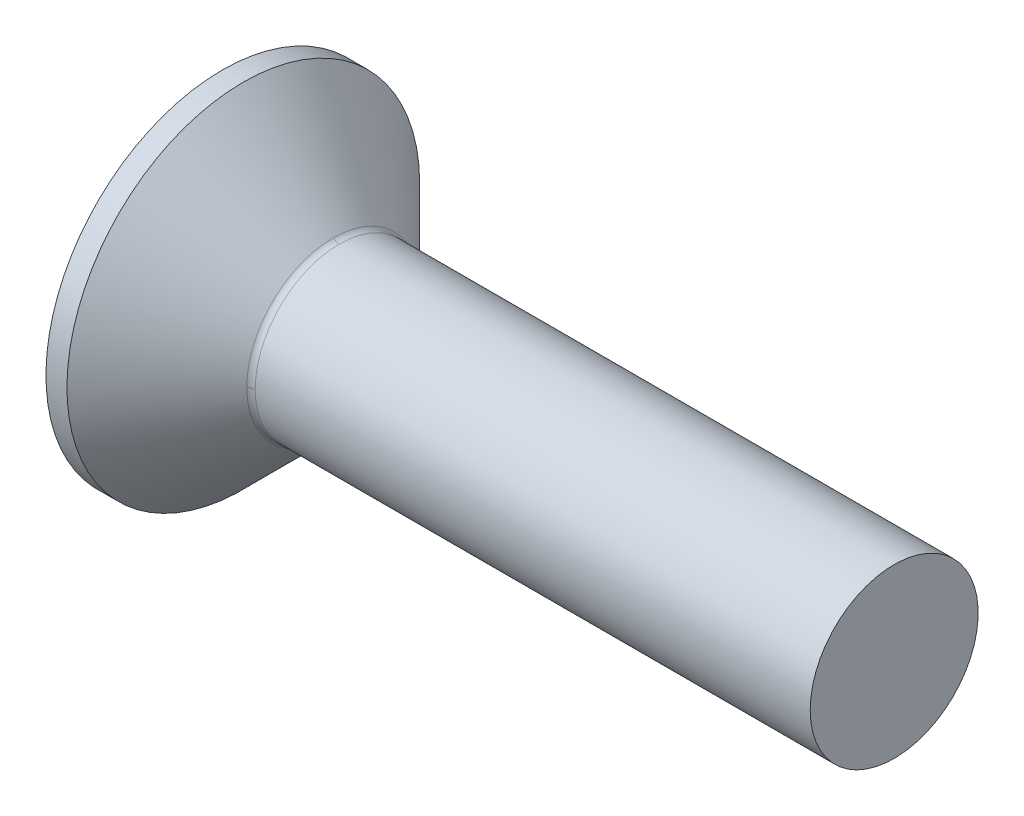
ISO-10303-21;
HEADER;
FILE_DESCRIPTION(('STEP AP214'),'2;1');
FILE_NAME('part.step','',(''),(''),'','','');
FILE_SCHEMA(('AUTOMOTIVE_DESIGN { 1 0 10303 214 1 1 1 1 }'));
ENDSEC;
DATA;
#1=APPLICATION_CONTEXT('core data for automotive mechanical design processes');
#2=APPLICATION_PROTOCOL_DEFINITION('international standard','automotive_design',2000,#1);
#3=PRODUCT_CONTEXT('',#1,'mechanical');
#4=PRODUCT('Part','Part','',(#3));
#5=PRODUCT_RELATED_PRODUCT_CATEGORY('part','',(#4));
#6=PRODUCT_DEFINITION_FORMATION('','',#4);
#7=PRODUCT_DEFINITION_CONTEXT('part definition',#1,'design');
#8=PRODUCT_DEFINITION('design','',#6,#7);
#9=PRODUCT_DEFINITION_SHAPE('','',#8);
#10=(LENGTH_UNIT() NAMED_UNIT(*) SI_UNIT(.MILLI.,.METRE.));
#11=(NAMED_UNIT(*) PLANE_ANGLE_UNIT() SI_UNIT($,.RADIAN.));
#12=(NAMED_UNIT(*) SI_UNIT($,.STERADIAN.) SOLID_ANGLE_UNIT());
#13=UNCERTAINTY_MEASURE_WITH_UNIT(LENGTH_MEASURE(1.E-05),#10,'distance_accuracy_value','');
#14=(GEOMETRIC_REPRESENTATION_CONTEXT(3) GLOBAL_UNCERTAINTY_ASSIGNED_CONTEXT((#13)) GLOBAL_UNIT_ASSIGNED_CONTEXT((#10,
#11,#12)) REPRESENTATION_CONTEXT('',''));
#15=CARTESIAN_POINT('',(0.,0.,0.));
#16=DIRECTION('',(0.,0.,1.));
#17=DIRECTION('',(1.,0.,0.));
#18=AXIS2_PLACEMENT_3D('',#15,#16,#17);
#19=CARTESIAN_POINT('',(16.,0.,0.));
#20=DIRECTION('',(1.,0.,0.));
#21=DIRECTION('',(0.,1.,0.));
#22=AXIS2_PLACEMENT_3D('',#19,#20,#21);
#23=PLANE('',#22);
#24=CARTESIAN_POINT('',(16.,0.,0.));
#25=DIRECTION('',(1.,0.,0.));
#26=DIRECTION('',(0.,0.,1.));
#27=AXIS2_PLACEMENT_3D('',#24,#25,#26);
#28=CIRCLE('',#27,2.);
#29=CARTESIAN_POINT('',(16.,0.,2.));
#30=VERTEX_POINT('',#29);
#31=EDGE_CURVE('E11',#30,#30,#28,.T.);
#32=ORIENTED_EDGE('',*,*,#31,.T.);
#33=EDGE_LOOP('',(#32));
#34=FACE_BOUND('',#33,.T.);
#35=ADVANCED_FACE('F17',(#34),#23,.T.);
#36=CARTESIAN_POINT('',(0.,0.,0.));
#37=DIRECTION('',(1.,0.,0.));
#38=DIRECTION('',(0.,0.,1.));
#39=AXIS2_PLACEMENT_3D('',#36,#37,#38);
#40=CYLINDRICAL_SURFACE('',#39,2.);
#41=CARTESIAN_POINT('',(2.78284271247462,0.,0.));
#42=DIRECTION('',(-1.,0.,0.));
#43=DIRECTION('',(0.,1.,0.));
#44=AXIS2_PLACEMENT_3D('',#41,#42,#43);
#45=CIRCLE('',#44,2.);
#46=CARTESIAN_POINT('',(2.78284271247462,0.,2.));
#47=VERTEX_POINT('',#46);
#48=CARTESIAN_POINT('',(2.78284271247462,2.,0.));
#49=VERTEX_POINT('',#48);
#50=EDGE_CURVE('E28',#47,#49,#45,.T.);
#51=ORIENTED_EDGE('',*,*,#50,.F.);
#52=CARTESIAN_POINT('',(2.78284271247462,0.,0.));
#53=DIRECTION('',(-1.,0.,0.));
#54=DIRECTION('',(0.,0.,1.));
#55=AXIS2_PLACEMENT_3D('',#52,#53,#54);
#56=CIRCLE('',#55,2.);
#57=EDGE_CURVE('E311',#49,#47,#56,.T.);
#58=ORIENTED_EDGE('',*,*,#57,.F.);
#59=EDGE_LOOP('',(#51,#58));
#60=FACE_BOUND('',#59,.T.);
#61=ORIENTED_EDGE('',*,*,#31,.F.);
#62=EDGE_LOOP('',(#61));
#63=FACE_BOUND('',#62,.T.);
#64=ADVANCED_FACE('F599',(#60,#63),#40,.T.);
#65=CARTESIAN_POINT('',(2.78284271247462,0.,0.));
#66=DIRECTION('',(1.,0.,0.));
#67=DIRECTION('',(0.,0.980066577841242,-0.198669330795061));
#68=AXIS2_PLACEMENT_3D('',#65,#66,#67);
#69=TOROIDAL_SURFACE('',#68,2.2,0.2);
#70=ORIENTED_EDGE('',*,*,#50,.T.);
#71=CARTESIAN_POINT('',(2.78284271247462,2.2,0.));
#72=DIRECTION('',(0.,0.,-1.));
#73=DIRECTION('',(0.,-1.,0.));
#74=AXIS2_PLACEMENT_3D('',#71,#72,#73);
#75=CIRCLE('',#74,0.2);
#76=CARTESIAN_POINT('',(2.64142135623731,2.05857864376269,0.));
#77=VERTEX_POINT('',#76);
#78=EDGE_CURVE('E300',#49,#77,#75,.T.);
#79=ORIENTED_EDGE('',*,*,#78,.T.);
#80=CARTESIAN_POINT('',(2.64142135623731,0.,0.));
#81=DIRECTION('',(-1.,0.,0.));
#82=DIRECTION('',(0.,1.,0.));
#83=AXIS2_PLACEMENT_3D('',#80,#81,#82);
#84=CIRCLE('',#83,2.05857864376269);
#85=CARTESIAN_POINT('',(2.64142135623731,0.,2.05857864376269));
#86=VERTEX_POINT('',#85);
#87=EDGE_CURVE('E332',#86,#77,#84,.T.);
#88=ORIENTED_EDGE('',*,*,#87,.F.);
#89=CARTESIAN_POINT('',(2.78284271247462,0.,2.2));
#90=DIRECTION('',(0.,1.,0.));
#91=DIRECTION('',(0.,0.,-1.));
#92=AXIS2_PLACEMENT_3D('',#89,#90,#91);
#93=CIRCLE('',#92,0.2);
#94=EDGE_CURVE('E303',#47,#86,#93,.T.);
#95=ORIENTED_EDGE('',*,*,#94,.F.);
#96=EDGE_LOOP('',(#70,#79,#88,#95));
#97=FACE_BOUND('',#96,.T.);
#98=ADVANCED_FACE('F604',(#97),#69,.F.);
#99=CARTESIAN_POINT('',(2.78284271247462,0.,0.));
#100=DIRECTION('',(1.,0.,0.));
#101=DIRECTION('',(0.,0.198669330795061,0.980066577841242));
#102=AXIS2_PLACEMENT_3D('',#99,#100,#101);
#103=TOROIDAL_SURFACE('',#102,2.2,0.2);
#104=ORIENTED_EDGE('',*,*,#57,.T.);
#105=ORIENTED_EDGE('',*,*,#94,.T.);
#106=CARTESIAN_POINT('',(2.64142135623731,0.,0.));
#107=DIRECTION('',(-1.,0.,0.));
#108=DIRECTION('',(0.,0.,1.));
#109=AXIS2_PLACEMENT_3D('',#106,#107,#108);
#110=CIRCLE('',#109,2.05857864376269);
#111=EDGE_CURVE('E259',#77,#86,#110,.T.);
#112=ORIENTED_EDGE('',*,*,#111,.F.);
#113=ORIENTED_EDGE('',*,*,#78,.F.);
#114=EDGE_LOOP('',(#104,#105,#112,#113));
#115=FACE_BOUND('',#114,.T.);
#116=ADVANCED_FACE('F625',(#115),#103,.F.);
#117=CARTESIAN_POINT('',(1.57071067811866,0.,0.));
#118=DIRECTION('',(-1.,0.,0.));
#119=DIRECTION('',(0.,-1.,0.));
#120=AXIS2_PLACEMENT_3D('',#117,#118,#119);
#121=CONICAL_SURFACE('',#120,3.12928932188134,0.785398163397448);
#122=ORIENTED_EDGE('',*,*,#111,.T.);
#123=ORIENTED_EDGE('',*,*,#87,.T.);
#124=EDGE_LOOP('',(#122,#123));
#125=FACE_BOUND('',#124,.T.);
#126=CARTESIAN_POINT('',(0.5,0.,0.));
#127=DIRECTION('',(1.,0.,0.));
#128=DIRECTION('',(0.,1.,0.));
#129=AXIS2_PLACEMENT_3D('',#126,#127,#128);
#130=CIRCLE('',#129,4.2);
#131=CARTESIAN_POINT('',(0.5,4.2,0.));
#132=VERTEX_POINT('',#131);
#133=EDGE_CURVE('E292',#132,#132,#130,.T.);
#134=ORIENTED_EDGE('',*,*,#133,.T.);
#135=EDGE_LOOP('',(#134));
#136=FACE_BOUND('',#135,.T.);
#137=ADVANCED_FACE('F630',(#125,#136),#121,.T.);
#138=CARTESIAN_POINT('',(2.6,0.,0.));
#139=DIRECTION('',(1.,0.,0.));
#140=DIRECTION('',(0.,1.,0.));
#141=AXIS2_PLACEMENT_3D('',#138,#139,#140);
#142=PLANE('',#141);
#143=DIRECTION('',(0.,0.,1.));
#144=VECTOR('',#143,1.);
#145=CARTESIAN_POINT('',(2.6,0.172517251725172,0.443540079669605));
#146=LINE('',#145,#144);
#147=CARTESIAN_POINT('',(2.6,0.172517251725172,0.443540079669605));
#148=VERTEX_POINT('',#147);
#149=CARTESIAN_POINT('',(2.6,0.172517251725172,0.668156442865066));
#150=VERTEX_POINT('',#149);
#151=EDGE_CURVE('E366',#148,#150,#146,.T.);
#152=ORIENTED_EDGE('',*,*,#151,.F.);
#153=DIRECTION('',(0.,-0.272628878987048,0.962119272409749));
#154=VECTOR('',#153,1.);
#155=CARTESIAN_POINT('',(2.6,0.232358321079116,0.232358321079116));
#156=LINE('',#155,#154);
#157=CARTESIAN_POINT('',(2.6,0.232358321079116,0.232358321079116));
#158=VERTEX_POINT('',#157);
#159=EDGE_CURVE('E317',#158,#148,#156,.T.);
#160=ORIENTED_EDGE('',*,*,#159,.F.);
#161=DIRECTION('',(0.,-0.96211927240975,0.272628878987045));
#162=VECTOR('',#161,1.);
#163=CARTESIAN_POINT('',(2.6,0.443540079669605,0.172517251725173));
#164=LINE('',#163,#162);
#165=CARTESIAN_POINT('',(2.6,0.443540079669605,0.172517251725173));
#166=VERTEX_POINT('',#165);
#167=EDGE_CURVE('E316',#166,#158,#164,.T.);
#168=ORIENTED_EDGE('',*,*,#167,.F.);
#169=DIRECTION('',(0.,-1.,0.));
#170=VECTOR('',#169,1.);
#171=CARTESIAN_POINT('',(2.6,0.668156442865066,0.172517251725173));
#172=LINE('',#171,#170);
#173=CARTESIAN_POINT('',(2.6,0.668156442865066,0.172517251725173));
#174=VERTEX_POINT('',#173);
#175=EDGE_CURVE('E273',#174,#166,#172,.T.);
#176=ORIENTED_EDGE('',*,*,#175,.F.);
#177=DIRECTION('',(0.,0.,1.));
#178=VECTOR('',#177,1.);
#179=CARTESIAN_POINT('',(2.6,0.668156442865066,-0.172517251725172));
#180=LINE('',#179,#178);
#181=CARTESIAN_POINT('',(2.6,0.668156442865066,-0.172517251725172));
#182=VERTEX_POINT('',#181);
#183=EDGE_CURVE('E338',#182,#174,#180,.T.);
#184=ORIENTED_EDGE('',*,*,#183,.F.);
#185=DIRECTION('',(0.,1.,0.));
#186=VECTOR('',#185,1.);
#187=CARTESIAN_POINT('',(2.6,0.443540079669605,-0.172517251725172));
#188=LINE('',#187,#186);
#189=CARTESIAN_POINT('',(2.6,0.443540079669605,-0.172517251725172));
#190=VERTEX_POINT('',#189);
#191=EDGE_CURVE('E337',#190,#182,#188,.T.);
#192=ORIENTED_EDGE('',*,*,#191,.F.);
#193=DIRECTION('',(0.,0.96211927240975,0.272628878987047));
#194=VECTOR('',#193,1.);
#195=CARTESIAN_POINT('',(2.6,0.232358321079116,-0.232358321079116));
#196=LINE('',#195,#194);
#197=CARTESIAN_POINT('',(2.6,0.232358321079116,-0.232358321079116));
#198=VERTEX_POINT('',#197);
#199=EDGE_CURVE('E304',#198,#190,#196,.T.);
#200=ORIENTED_EDGE('',*,*,#199,.F.);
#201=DIRECTION('',(0.,0.272628878987045,0.96211927240975));
#202=VECTOR('',#201,1.);
#203=CARTESIAN_POINT('',(2.6,0.172517251725173,-0.443540079669605));
#204=LINE('',#203,#202);
#205=CARTESIAN_POINT('',(2.6,0.172517251725173,-0.443540079669605));
#206=VERTEX_POINT('',#205);
#207=EDGE_CURVE('E339',#206,#198,#204,.T.);
#208=ORIENTED_EDGE('',*,*,#207,.F.);
#209=DIRECTION('',(0.,0.,1.));
#210=VECTOR('',#209,1.);
#211=CARTESIAN_POINT('',(2.6,0.172517251725173,-0.668156442865066));
#212=LINE('',#211,#210);
#213=CARTESIAN_POINT('',(2.6,0.172517251725173,-0.668156442865066));
#214=VERTEX_POINT('',#213);
#215=EDGE_CURVE('E299',#214,#206,#212,.T.);
#216=ORIENTED_EDGE('',*,*,#215,.F.);
#217=DIRECTION('',(0.,1.,0.));
#218=VECTOR('',#217,1.);
#219=CARTESIAN_POINT('',(2.6,-0.172517251725172,-0.668156442865066));
#220=LINE('',#219,#218);
#221=CARTESIAN_POINT('',(2.6,-0.172517251725172,-0.668156442865066));
#222=VERTEX_POINT('',#221);
#223=EDGE_CURVE('E298',#222,#214,#220,.T.);
#224=ORIENTED_EDGE('',*,*,#223,.F.);
#225=DIRECTION('',(0.,0.,-1.));
#226=VECTOR('',#225,1.);
#227=CARTESIAN_POINT('',(2.6,-0.172517251725172,-0.443540079669605));
#228=LINE('',#227,#226);
#229=CARTESIAN_POINT('',(2.6,-0.172517251725172,-0.443540079669605));
#230=VERTEX_POINT('',#229);
#231=EDGE_CURVE('E261',#230,#222,#228,.T.);
#232=ORIENTED_EDGE('',*,*,#231,.F.);
#233=DIRECTION('',(0.,0.272628878987046,-0.96211927240975));
#234=VECTOR('',#233,1.);
#235=CARTESIAN_POINT('',(2.6,-0.232358321079116,-0.232358321079116));
#236=LINE('',#235,#234);
#237=CARTESIAN_POINT('',(2.6,-0.232358321079116,-0.232358321079116));
#238=VERTEX_POINT('',#237);
#239=EDGE_CURVE('E378',#238,#230,#236,.T.);
#240=ORIENTED_EDGE('',*,*,#239,.F.);
#241=DIRECTION('',(0.,0.96211927240975,-0.272628878987046));
#242=VECTOR('',#241,1.);
#243=CARTESIAN_POINT('',(2.6,-0.443540079669605,-0.172517251725172));
#244=LINE('',#243,#242);
#245=CARTESIAN_POINT('',(2.6,-0.443540079669605,-0.172517251725172));
#246=VERTEX_POINT('',#245);
#247=EDGE_CURVE('E284',#246,#238,#244,.T.);
#248=ORIENTED_EDGE('',*,*,#247,.F.);
#249=DIRECTION('',(0.,1.,0.));
#250=VECTOR('',#249,1.);
#251=CARTESIAN_POINT('',(2.6,-0.668156442865066,-0.172517251725172));
#252=LINE('',#251,#250);
#253=CARTESIAN_POINT('',(2.6,-0.668156442865066,-0.172517251725172));
#254=VERTEX_POINT('',#253);
#255=EDGE_CURVE('E230',#254,#246,#252,.T.);
#256=ORIENTED_EDGE('',*,*,#255,.F.);
#257=DIRECTION('',(0.,0.,-1.));
#258=VECTOR('',#257,1.);
#259=CARTESIAN_POINT('',(2.6,-0.668156442865066,0.172517251725173));
#260=LINE('',#259,#258);
#261=CARTESIAN_POINT('',(2.6,-0.668156442865066,0.172517251725173));
#262=VERTEX_POINT('',#261);
#263=EDGE_CURVE('E229',#262,#254,#260,.T.);
#264=ORIENTED_EDGE('',*,*,#263,.F.);
#265=DIRECTION('',(0.,-1.,0.));
#266=VECTOR('',#265,1.);
#267=CARTESIAN_POINT('',(2.6,-0.443540079669605,0.172517251725173));
#268=LINE('',#267,#266);
#269=CARTESIAN_POINT('',(2.6,-0.443540079669605,0.172517251725173));
#270=VERTEX_POINT('',#269);
#271=EDGE_CURVE('E225',#270,#262,#268,.T.);
#272=ORIENTED_EDGE('',*,*,#271,.F.);
#273=DIRECTION('',(0.,-0.96211927240975,-0.272628878987045));
#274=VECTOR('',#273,1.);
#275=CARTESIAN_POINT('',(2.6,-0.232358321079116,0.232358321079116));
#276=LINE('',#275,#274);
#277=CARTESIAN_POINT('',(2.6,-0.232358321079116,0.232358321079116));
#278=VERTEX_POINT('',#277);
#279=EDGE_CURVE('E21',#278,#270,#276,.T.);
#280=ORIENTED_EDGE('',*,*,#279,.F.);
#281=DIRECTION('',(0.,-0.272628878987044,-0.962119272409751));
#282=VECTOR('',#281,1.);
#283=CARTESIAN_POINT('',(2.6,-0.172517251725173,0.443540079669605));
#284=LINE('',#283,#282);
#285=CARTESIAN_POINT('',(2.6,-0.172517251725173,0.443540079669605));
#286=VERTEX_POINT('',#285);
#287=EDGE_CURVE('E410',#286,#278,#284,.T.);
#288=ORIENTED_EDGE('',*,*,#287,.F.);
#289=DIRECTION('',(0.,0.,-1.));
#290=VECTOR('',#289,1.);
#291=CARTESIAN_POINT('',(2.6,-0.172517251725172,0.668156442865066));
#292=LINE('',#291,#290);
#293=CARTESIAN_POINT('',(2.6,-0.172517251725172,0.668156442865066));
#294=VERTEX_POINT('',#293);
#295=EDGE_CURVE('E293',#294,#286,#292,.T.);
#296=ORIENTED_EDGE('',*,*,#295,.F.);
#297=DIRECTION('',(0.,-1.,0.));
#298=VECTOR('',#297,1.);
#299=CARTESIAN_POINT('',(2.6,0.172517251725172,0.668156442865066));
#300=LINE('',#299,#298);
#301=EDGE_CURVE('E288',#150,#294,#300,.T.);
#302=ORIENTED_EDGE('',*,*,#301,.F.);
#303=EDGE_LOOP('',(#152,#160,#168,#176,#184,#192,#200,#208,#216,#224,#232,#240,#248,#256,#264,
#272,#280,#288,#296,#302));
#304=FACE_BOUND('',#303,.T.);
#305=ADVANCED_FACE('F503',(#304),#142,.F.);
#306=CARTESIAN_POINT('',(0.,0.,0.));
#307=DIRECTION('',(1.,0.,0.));
#308=DIRECTION('',(0.,1.,0.));
#309=AXIS2_PLACEMENT_3D('',#306,#307,#308);
#310=CYLINDRICAL_SURFACE('',#309,4.2);
#311=ORIENTED_EDGE('',*,*,#133,.F.);
#312=EDGE_LOOP('',(#311));
#313=FACE_BOUND('',#312,.T.);
#314=CARTESIAN_POINT('',(0.,0.,0.));
#315=DIRECTION('',(1.,0.,0.));
#316=DIRECTION('',(0.,1.,0.));
#317=AXIS2_PLACEMENT_3D('',#314,#315,#316);
#318=CIRCLE('',#317,4.2);
#319=CARTESIAN_POINT('',(0.,4.2,0.));
#320=VERTEX_POINT('',#319);
#321=EDGE_CURVE('E357',#320,#320,#318,.T.);
#322=ORIENTED_EDGE('',*,*,#321,.T.);
#323=EDGE_LOOP('',(#322));
#324=FACE_BOUND('',#323,.T.);
#325=ADVANCED_FACE('F647',(#313,#324),#310,.T.);
#326=CARTESIAN_POINT('',(0.,0.575,2.22696542406926));
#327=DIRECTION('',(0.514206841452647,0.,0.85766620791733));
#328=DIRECTION('',(0.,-1.,0.));
#329=AXIS2_PLACEMENT_3D('',#326,#327,#328);
#330=PLANE('',#329);
#331=DIRECTION('',(0.,-1.,0.));
#332=VECTOR('',#331,1.);
#333=CARTESIAN_POINT('',(0.,0.575,2.22696542406926));
#334=LINE('',#333,#332);
#335=CARTESIAN_POINT('',(0.,0.575,2.22696542406926));
#336=VERTEX_POINT('',#335);
#337=CARTESIAN_POINT('',(0.,-0.575,2.22696542406926));
#338=VERTEX_POINT('',#337);
#339=EDGE_CURVE('E321',#336,#338,#334,.T.);
#340=ORIENTED_EDGE('',*,*,#339,.F.);
#341=DIRECTION('',(0.850205551202319,-0.131612718017855,-0.509733865032247));
#342=VECTOR('',#341,1.);
#343=CARTESIAN_POINT('',(0.,0.575,2.22696542406926));
#344=LINE('',#343,#342);
#345=EDGE_CURVE('E362',#336,#150,#344,.T.);
#346=ORIENTED_EDGE('',*,*,#345,.T.);
#347=ORIENTED_EDGE('',*,*,#301,.T.);
#348=DIRECTION('',(0.850205551202319,0.131612718017856,-0.509733865032246));
#349=VECTOR('',#348,1.);
#350=CARTESIAN_POINT('',(0.,-0.575,2.22696542406926));
#351=LINE('',#350,#349);
#352=EDGE_CURVE('E325',#338,#294,#351,.T.);
#353=ORIENTED_EDGE('',*,*,#352,.F.);
#354=EDGE_LOOP('',(#340,#346,#347,#353));
#355=FACE_BOUND('',#354,.T.);
#356=ADVANCED_FACE('F520',(#355),#330,.F.);
#357=CARTESIAN_POINT('',(0.,-0.575,2.22696542406926));
#358=DIRECTION('',(0.152978962750563,-0.988229445501277,0.));
#359=DIRECTION('',(0.,0.,-1.));
#360=AXIS2_PLACEMENT_3D('',#357,#358,#359);
#361=PLANE('',#360);
#362=DIRECTION('',(0.,0.,-1.));
#363=VECTOR('',#362,1.);
#364=CARTESIAN_POINT('',(0.,-0.575,2.22696542406926));
#365=LINE('',#364,#363);
#366=CARTESIAN_POINT('',(0.,-0.575,1.47831908553879));
#367=VERTEX_POINT('',#366);
#368=EDGE_CURVE('E318',#338,#367,#365,.T.);
#369=ORIENTED_EDGE('',*,*,#368,.F.);
#370=ORIENTED_EDGE('',*,*,#352,.T.);
#371=ORIENTED_EDGE('',*,*,#295,.T.);
#372=DIRECTION('',(0.919655056316218,0.142363574819613,-0.366015286506718));
#373=VECTOR('',#372,1.);
#374=CARTESIAN_POINT('',(0.,-0.575,1.47831908553879));
#375=LINE('',#374,#373);
#376=EDGE_CURVE('E406',#367,#286,#375,.T.);
#377=ORIENTED_EDGE('',*,*,#376,.F.);
#378=EDGE_LOOP('',(#369,#370,#371,#377));
#379=FACE_BOUND('',#378,.T.);
#380=ADVANCED_FACE('F524',(#379),#361,.F.);
#381=CARTESIAN_POINT('',(0.,-0.575,1.47831908553879));
#382=DIRECTION('',(0.249312008142373,-0.931738638625509,0.264020135384217));
#383=DIRECTION('',(-0.966015607772417,-0.258483743280089,0.));
#384=AXIS2_PLACEMENT_3D('',#381,#382,#383);
#385=PLANE('',#384);
#386=DIRECTION('',(0.,-0.272628878987044,-0.962119272409751));
#387=VECTOR('',#386,1.);
#388=CARTESIAN_POINT('',(0.,-0.575,1.47831908553879));
#389=LINE('',#388,#387);
#390=CARTESIAN_POINT('',(0.,-0.774450284156694,0.774450284156694));
#391=VERTEX_POINT('',#390);
#392=EDGE_CURVE('E255',#367,#391,#389,.T.);
#393=ORIENTED_EDGE('',*,*,#392,.F.);
#394=ORIENTED_EDGE('',*,*,#376,.T.);
#395=ORIENTED_EDGE('',*,*,#287,.T.);
#396=DIRECTION('',(0.95917274636367,0.199984552694921,-0.199984552694921));
#397=VECTOR('',#396,1.);
#398=CARTESIAN_POINT('',(0.,-0.774450284156694,0.774450284156694));
#399=LINE('',#398,#397);
#400=EDGE_CURVE('E434',#391,#278,#399,.T.);
#401=ORIENTED_EDGE('',*,*,#400,.F.);
#402=EDGE_LOOP('',(#393,#394,#395,#401));
#403=FACE_BOUND('',#402,.T.);
#404=ADVANCED_FACE('F19',(#403),#385,.F.);
#405=CARTESIAN_POINT('',(0.,-0.774450284156694,0.774450284156694));
#406=DIRECTION('',(0.249312008142374,-0.264020135384219,0.931738638625508));
#407=DIRECTION('',(-0.7270686071443,-0.686564811583908,0.));
#408=AXIS2_PLACEMENT_3D('',#405,#406,#407);
#409=PLANE('',#408);
#410=DIRECTION('',(0.,-0.96211927240975,-0.272628878987046));
#411=VECTOR('',#410,1.);
#412=CARTESIAN_POINT('',(0.,-0.774450284156694,0.774450284156694));
#413=LINE('',#412,#411);
#414=CARTESIAN_POINT('',(0.,-1.47831908553879,0.575));
#415=VERTEX_POINT('',#414);
#416=EDGE_CURVE('E248',#391,#415,#413,.T.);
#417=ORIENTED_EDGE('',*,*,#416,.F.);
#418=ORIENTED_EDGE('',*,*,#400,.T.);
#419=ORIENTED_EDGE('',*,*,#279,.T.);
#420=DIRECTION('',(0.919655056316218,0.366015286506719,-0.142363574819612));
#421=VECTOR('',#420,1.);
#422=CARTESIAN_POINT('',(0.,-1.47831908553879,0.575));
#423=LINE('',#422,#421);
#424=EDGE_CURVE('E328',#415,#270,#423,.T.);
#425=ORIENTED_EDGE('',*,*,#424,.F.);
#426=EDGE_LOOP('',(#417,#418,#419,#425));
#427=FACE_BOUND('',#426,.T.);
#428=ADVANCED_FACE('F530',(#427),#409,.F.);
#429=CARTESIAN_POINT('',(0.,-1.47831908553879,0.575));
#430=DIRECTION('',(0.152978962750562,0.,0.988229445501277));
#431=DIRECTION('',(0.,-1.,0.));
#432=AXIS2_PLACEMENT_3D('',#429,#430,#431);
#433=PLANE('',#432);
#434=DIRECTION('',(0.,-1.,0.));
#435=VECTOR('',#434,1.);
#436=CARTESIAN_POINT('',(0.,-1.47831908553879,0.575));
#437=LINE('',#436,#435);
#438=CARTESIAN_POINT('',(0.,-2.22696542406926,0.575));
#439=VERTEX_POINT('',#438);
#440=EDGE_CURVE('E222',#415,#439,#437,.T.);
#441=ORIENTED_EDGE('',*,*,#440,.F.);
#442=ORIENTED_EDGE('',*,*,#424,.T.);
#443=ORIENTED_EDGE('',*,*,#271,.T.);
#444=DIRECTION('',(0.85020555120232,0.509733865032246,-0.131612718017855));
#445=VECTOR('',#444,1.);
#446=CARTESIAN_POINT('',(0.,-2.22696542406926,0.575));
#447=LINE('',#446,#445);
#448=EDGE_CURVE('E217',#439,#262,#447,.T.);
#449=ORIENTED_EDGE('',*,*,#448,.F.);
#450=EDGE_LOOP('',(#441,#442,#443,#449));
#451=FACE_BOUND('',#450,.T.);
#452=ADVANCED_FACE('F219',(#451),#433,.F.);
#453=CARTESIAN_POINT('',(0.,-2.22696542406926,0.575));
#454=DIRECTION('',(0.514206841452646,-0.85766620791733,0.));
#455=DIRECTION('',(0.,0.,-1.));
#456=AXIS2_PLACEMENT_3D('',#453,#454,#455);
#457=PLANE('',#456);
#458=DIRECTION('',(0.,0.,-1.));
#459=VECTOR('',#458,1.);
#460=CARTESIAN_POINT('',(0.,-2.22696542406926,0.575));
#461=LINE('',#460,#459);
#462=CARTESIAN_POINT('',(0.,-2.22696542406926,-0.575));
#463=VERTEX_POINT('',#462);
#464=EDGE_CURVE('E233',#439,#463,#461,.T.);
#465=ORIENTED_EDGE('',*,*,#464,.F.);
#466=ORIENTED_EDGE('',*,*,#448,.T.);
#467=ORIENTED_EDGE('',*,*,#263,.T.);
#468=DIRECTION('',(0.85020555120232,0.509733865032246,0.131612718017856));
#469=VECTOR('',#468,1.);
#470=CARTESIAN_POINT('',(0.,-2.22696542406926,-0.575));
#471=LINE('',#470,#469);
#472=EDGE_CURVE('E236',#463,#254,#471,.T.);
#473=ORIENTED_EDGE('',*,*,#472,.F.);
#474=EDGE_LOOP('',(#465,#466,#467,#473));
#475=FACE_BOUND('',#474,.T.);
#476=ADVANCED_FACE('F234',(#475),#457,.F.);
#477=CARTESIAN_POINT('',(0.,-2.22696542406926,-0.575));
#478=DIRECTION('',(0.152978962750563,0.,-0.988229445501277));
#479=DIRECTION('',(0.,-1.,0.));
#480=AXIS2_PLACEMENT_3D('',#477,#478,#479);
#481=PLANE('',#480);
#482=DIRECTION('',(0.,1.,0.));
#483=VECTOR('',#482,1.);
#484=CARTESIAN_POINT('',(0.,-2.22696542406926,-0.575));
#485=LINE('',#484,#483);
#486=CARTESIAN_POINT('',(0.,-1.47831908553879,-0.575));
#487=VERTEX_POINT('',#486);
#488=EDGE_CURVE('E241',#463,#487,#485,.T.);
#489=ORIENTED_EDGE('',*,*,#488,.F.);
#490=ORIENTED_EDGE('',*,*,#472,.T.);
#491=ORIENTED_EDGE('',*,*,#255,.T.);
#492=DIRECTION('',(0.919655056316218,0.366015286506718,0.142363574819613));
#493=VECTOR('',#492,1.);
#494=CARTESIAN_POINT('',(0.,-1.47831908553879,-0.575));
#495=LINE('',#494,#493);
#496=EDGE_CURVE('E286',#487,#246,#495,.T.);
#497=ORIENTED_EDGE('',*,*,#496,.F.);
#498=EDGE_LOOP('',(#489,#490,#491,#497));
#499=FACE_BOUND('',#498,.T.);
#500=ADVANCED_FACE('F535',(#499),#481,.F.);
#501=CARTESIAN_POINT('',(0.,-1.47831908553879,-0.575));
#502=DIRECTION('',(0.249312008142374,-0.264020135384218,-0.931738638625509));
#503=DIRECTION('',(0.,-0.96211927240975,0.272628878987045));
#504=AXIS2_PLACEMENT_3D('',#501,#502,#503);
#505=PLANE('',#504);
#506=DIRECTION('',(0.,0.96211927240975,-0.272628878987045));
#507=VECTOR('',#506,1.);
#508=CARTESIAN_POINT('',(0.,-1.47831908553879,-0.575));
#509=LINE('',#508,#507);
#510=CARTESIAN_POINT('',(0.,-0.774450284156695,-0.774450284156695));
#511=VERTEX_POINT('',#510);
#512=EDGE_CURVE('E267',#487,#511,#509,.T.);
#513=ORIENTED_EDGE('',*,*,#512,.F.);
#514=ORIENTED_EDGE('',*,*,#496,.T.);
#515=ORIENTED_EDGE('',*,*,#247,.T.);
#516=DIRECTION('',(0.95917274636367,0.199984552694921,0.199984552694921));
#517=VECTOR('',#516,1.);
#518=CARTESIAN_POINT('',(0.,-0.774450284156695,-0.774450284156695));
#519=LINE('',#518,#517);
#520=EDGE_CURVE('E263',#511,#238,#519,.T.);
#521=ORIENTED_EDGE('',*,*,#520,.F.);
#522=EDGE_LOOP('',(#513,#514,#515,#521));
#523=FACE_BOUND('',#522,.T.);
#524=ADVANCED_FACE('F540',(#523),#505,.F.);
#525=CARTESIAN_POINT('',(0.,-0.774450284156695,-0.774450284156695));
#526=DIRECTION('',(0.249312008142374,-0.931738638625509,-0.264020135384218));
#527=DIRECTION('',(0.,0.272628878987045,-0.96211927240975));
#528=AXIS2_PLACEMENT_3D('',#525,#526,#527);
#529=PLANE('',#528);
#530=DIRECTION('',(0.,0.272628878987045,-0.96211927240975));
#531=VECTOR('',#530,1.);
#532=CARTESIAN_POINT('',(0.,-0.774450284156695,-0.774450284156695));
#533=LINE('',#532,#531);
#534=CARTESIAN_POINT('',(0.,-0.575,-1.47831908553879));
#535=VERTEX_POINT('',#534);
#536=EDGE_CURVE('E268',#511,#535,#533,.T.);
#537=ORIENTED_EDGE('',*,*,#536,.F.);
#538=ORIENTED_EDGE('',*,*,#520,.T.);
#539=ORIENTED_EDGE('',*,*,#239,.T.);
#540=DIRECTION('',(0.919655056316218,0.142363574819613,0.366015286506718));
#541=VECTOR('',#540,1.);
#542=CARTESIAN_POINT('',(0.,-0.575,-1.47831908553879));
#543=LINE('',#542,#541);
#544=EDGE_CURVE('E264',#535,#230,#543,.T.);
#545=ORIENTED_EDGE('',*,*,#544,.F.);
#546=EDGE_LOOP('',(#537,#538,#539,#545));
#547=FACE_BOUND('',#546,.T.);
#548=ADVANCED_FACE('F542',(#547),#529,.F.);
#549=CARTESIAN_POINT('',(0.,-0.575,-1.47831908553879));
#550=DIRECTION('',(0.152978962750563,-0.988229445501277,0.));
#551=DIRECTION('',(0.,0.,-1.));
#552=AXIS2_PLACEMENT_3D('',#549,#550,#551);
#553=PLANE('',#552);
#554=DIRECTION('',(0.,0.,-1.));
#555=VECTOR('',#554,1.);
#556=CARTESIAN_POINT('',(0.,-0.575,-1.47831908553879));
#557=LINE('',#556,#555);
#558=CARTESIAN_POINT('',(0.,-0.575,-2.22696542406926));
#559=VERTEX_POINT('',#558);
#560=EDGE_CURVE('E272',#535,#559,#557,.T.);
#561=ORIENTED_EDGE('',*,*,#560,.F.);
#562=ORIENTED_EDGE('',*,*,#544,.T.);
#563=ORIENTED_EDGE('',*,*,#231,.T.);
#564=DIRECTION('',(0.850205551202319,0.131612718017856,0.509733865032247));
#565=VECTOR('',#564,1.);
#566=CARTESIAN_POINT('',(0.,-0.575,-2.22696542406926));
#567=LINE('',#566,#565);
#568=EDGE_CURVE('E294',#559,#222,#567,.T.);
#569=ORIENTED_EDGE('',*,*,#568,.F.);
#570=EDGE_LOOP('',(#561,#562,#563,#569));
#571=FACE_BOUND('',#570,.T.);
#572=ADVANCED_FACE('F545',(#571),#553,.F.);
#573=CARTESIAN_POINT('',(0.,-0.575,-2.22696542406926));
#574=DIRECTION('',(0.514206841452647,0.,-0.85766620791733));
#575=DIRECTION('',(0.,-1.,0.));
#576=AXIS2_PLACEMENT_3D('',#573,#574,#575);
#577=PLANE('',#576);
#578=DIRECTION('',(0.,1.,0.));
#579=VECTOR('',#578,1.);
#580=CARTESIAN_POINT('',(0.,-0.575,-2.22696542406926));
#581=LINE('',#580,#579);
#582=CARTESIAN_POINT('',(0.,0.575,-2.22696542406926));
#583=VERTEX_POINT('',#582);
#584=EDGE_CURVE('E384',#559,#583,#581,.T.);
#585=ORIENTED_EDGE('',*,*,#584,.F.);
#586=ORIENTED_EDGE('',*,*,#568,.T.);
#587=ORIENTED_EDGE('',*,*,#223,.T.);
#588=DIRECTION('',(0.850205551202319,-0.131612718017855,0.509733865032247));
#589=VECTOR('',#588,1.);
#590=CARTESIAN_POINT('',(0.,0.575,-2.22696542406926));
#591=LINE('',#590,#589);
#592=EDGE_CURVE('E342',#583,#214,#591,.T.);
#593=ORIENTED_EDGE('',*,*,#592,.F.);
#594=EDGE_LOOP('',(#585,#586,#587,#593));
#595=FACE_BOUND('',#594,.T.);
#596=ADVANCED_FACE('F462',(#595),#577,.F.);
#597=CARTESIAN_POINT('',(0.,0.575,-2.22696542406926));
#598=DIRECTION('',(0.152978962750562,0.988229445501277,0.));
#599=DIRECTION('',(0.,0.,-1.));
#600=AXIS2_PLACEMENT_3D('',#597,#598,#599);
#601=PLANE('',#600);
#602=DIRECTION('',(0.,0.,1.));
#603=VECTOR('',#602,1.);
#604=CARTESIAN_POINT('',(0.,0.575,-2.22696542406926));
#605=LINE('',#604,#603);
#606=CARTESIAN_POINT('',(0.,0.575,-1.47831908553879));
#607=VERTEX_POINT('',#606);
#608=EDGE_CURVE('E375',#583,#607,#605,.T.);
#609=ORIENTED_EDGE('',*,*,#608,.F.);
#610=ORIENTED_EDGE('',*,*,#592,.T.);
#611=ORIENTED_EDGE('',*,*,#215,.T.);
#612=DIRECTION('',(0.919655056316218,-0.142363574819612,0.366015286506718));
#613=VECTOR('',#612,1.);
#614=CARTESIAN_POINT('',(0.,0.575,-1.47831908553879));
#615=LINE('',#614,#613);
#616=EDGE_CURVE('E307',#607,#206,#615,.T.);
#617=ORIENTED_EDGE('',*,*,#616,.F.);
#618=EDGE_LOOP('',(#609,#610,#611,#617));
#619=FACE_BOUND('',#618,.T.);
#620=ADVANCED_FACE('F469',(#619),#601,.F.);
#621=CARTESIAN_POINT('',(0.,0.575,-1.47831908553879));
#622=DIRECTION('',(0.249312008142374,0.931738638625508,-0.264020135384221));
#623=DIRECTION('',(-0.727068607144303,0.,-0.686564811583906));
#624=AXIS2_PLACEMENT_3D('',#621,#622,#623);
#625=PLANE('',#624);
#626=DIRECTION('',(0.,0.272628878987048,0.962119272409749));
#627=VECTOR('',#626,1.);
#628=CARTESIAN_POINT('',(0.,0.575,-1.47831908553879));
#629=LINE('',#628,#627);
#630=CARTESIAN_POINT('',(0.,0.774450284156695,-0.774450284156695));
#631=VERTEX_POINT('',#630);
#632=EDGE_CURVE('E370',#607,#631,#629,.T.);
#633=ORIENTED_EDGE('',*,*,#632,.F.);
#634=ORIENTED_EDGE('',*,*,#616,.T.);
#635=ORIENTED_EDGE('',*,*,#207,.T.);
#636=DIRECTION('',(0.95917274636367,-0.199984552694921,0.199984552694921));
#637=VECTOR('',#636,1.);
#638=CARTESIAN_POINT('',(0.,0.774450284156695,-0.774450284156695));
#639=LINE('',#638,#637);
#640=EDGE_CURVE('E308',#631,#198,#639,.T.);
#641=ORIENTED_EDGE('',*,*,#640,.F.);
#642=EDGE_LOOP('',(#633,#634,#635,#641));
#643=FACE_BOUND('',#642,.T.);
#644=ADVANCED_FACE('F473',(#643),#625,.F.);
#645=CARTESIAN_POINT('',(0.,0.774450284156695,-0.774450284156695));
#646=DIRECTION('',(0.249312008142374,0.26402013538422,-0.931738638625508));
#647=DIRECTION('',(-0.966015607772417,0.,-0.258483743280091));
#648=AXIS2_PLACEMENT_3D('',#645,#646,#647);
#649=PLANE('',#648);
#650=DIRECTION('',(0.,0.96211927240975,0.272628878987047));
#651=VECTOR('',#650,1.);
#652=CARTESIAN_POINT('',(0.,0.774450284156695,-0.774450284156695));
#653=LINE('',#652,#651);
#654=CARTESIAN_POINT('',(0.,1.47831908553879,-0.575));
#655=VERTEX_POINT('',#654);
#656=EDGE_CURVE('E374',#631,#655,#653,.T.);
#657=ORIENTED_EDGE('',*,*,#656,.F.);
#658=ORIENTED_EDGE('',*,*,#640,.T.);
#659=ORIENTED_EDGE('',*,*,#199,.T.);
#660=DIRECTION('',(0.919655056316218,-0.366015286506718,0.142363574819613));
#661=VECTOR('',#660,1.);
#662=CARTESIAN_POINT('',(0.,1.47831908553879,-0.575));
#663=LINE('',#662,#661);
#664=EDGE_CURVE('E333',#655,#190,#663,.T.);
#665=ORIENTED_EDGE('',*,*,#664,.F.);
#666=EDGE_LOOP('',(#657,#658,#659,#665));
#667=FACE_BOUND('',#666,.T.);
#668=ADVANCED_FACE('F588',(#667),#649,.F.);
#669=CARTESIAN_POINT('',(0.,1.47831908553879,-0.575));
#670=DIRECTION('',(0.152978962750563,0.,-0.988229445501277));
#671=DIRECTION('',(0.,-1.,0.));
#672=AXIS2_PLACEMENT_3D('',#669,#670,#671);
#673=PLANE('',#672);
#674=DIRECTION('',(0.,1.,0.));
#675=VECTOR('',#674,1.);
#676=CARTESIAN_POINT('',(0.,1.47831908553879,-0.575));
#677=LINE('',#676,#675);
#678=CARTESIAN_POINT('',(0.,2.22696542406926,-0.575));
#679=VERTEX_POINT('',#678);
#680=EDGE_CURVE('E385',#655,#679,#677,.T.);
#681=ORIENTED_EDGE('',*,*,#680,.F.);
#682=ORIENTED_EDGE('',*,*,#664,.T.);
#683=ORIENTED_EDGE('',*,*,#191,.T.);
#684=DIRECTION('',(0.850205551202319,-0.509733865032247,0.131612718017856));
#685=VECTOR('',#684,1.);
#686=CARTESIAN_POINT('',(0.,2.22696542406926,-0.575));
#687=LINE('',#686,#685);
#688=EDGE_CURVE('E276',#679,#182,#687,.T.);
#689=ORIENTED_EDGE('',*,*,#688,.F.);
#690=EDGE_LOOP('',(#681,#682,#683,#689));
#691=FACE_BOUND('',#690,.T.);
#692=ADVANCED_FACE('F498',(#691),#673,.F.);
#693=CARTESIAN_POINT('',(0.,2.22696542406926,-0.575));
#694=DIRECTION('',(0.514206841452647,0.85766620791733,0.));
#695=DIRECTION('',(0.,0.,-1.));
#696=AXIS2_PLACEMENT_3D('',#693,#694,#695);
#697=PLANE('',#696);
#698=DIRECTION('',(0.,0.,1.));
#699=VECTOR('',#698,1.);
#700=CARTESIAN_POINT('',(0.,2.22696542406926,-0.575));
#701=LINE('',#700,#699);
#702=CARTESIAN_POINT('',(0.,2.22696542406926,0.575));
#703=VERTEX_POINT('',#702);
#704=EDGE_CURVE('E347',#679,#703,#701,.T.);
#705=ORIENTED_EDGE('',*,*,#704,.F.);
#706=ORIENTED_EDGE('',*,*,#688,.T.);
#707=ORIENTED_EDGE('',*,*,#183,.T.);
#708=DIRECTION('',(0.850205551202319,-0.509733865032247,-0.131612718017855));
#709=VECTOR('',#708,1.);
#710=CARTESIAN_POINT('',(0.,2.22696542406926,0.575));
#711=LINE('',#710,#709);
#712=EDGE_CURVE('E277',#703,#174,#711,.T.);
#713=ORIENTED_EDGE('',*,*,#712,.F.);
#714=EDGE_LOOP('',(#705,#706,#707,#713));
#715=FACE_BOUND('',#714,.T.);
#716=ADVANCED_FACE('F494',(#715),#697,.F.);
#717=CARTESIAN_POINT('',(0.,2.22696542406926,0.575));
#718=DIRECTION('',(0.152978962750563,0.,0.988229445501277));
#719=DIRECTION('',(0.,-1.,0.));
#720=AXIS2_PLACEMENT_3D('',#717,#718,#719);
#721=PLANE('',#720);
#722=DIRECTION('',(0.,-1.,0.));
#723=VECTOR('',#722,1.);
#724=CARTESIAN_POINT('',(0.,2.22696542406926,0.575));
#725=LINE('',#724,#723);
#726=CARTESIAN_POINT('',(0.,1.47831908553879,0.575));
#727=VERTEX_POINT('',#726);
#728=EDGE_CURVE('E343',#703,#727,#725,.T.);
#729=ORIENTED_EDGE('',*,*,#728,.F.);
#730=ORIENTED_EDGE('',*,*,#712,.T.);
#731=ORIENTED_EDGE('',*,*,#175,.T.);
#732=DIRECTION('',(0.919655056316218,-0.366015286506718,-0.142363574819612));
#733=VECTOR('',#732,1.);
#734=CARTESIAN_POINT('',(0.,1.47831908553879,0.575));
#735=LINE('',#734,#733);
#736=EDGE_CURVE('E312',#727,#166,#735,.T.);
#737=ORIENTED_EDGE('',*,*,#736,.F.);
#738=EDGE_LOOP('',(#729,#730,#731,#737));
#739=FACE_BOUND('',#738,.T.);
#740=ADVANCED_FACE('F508',(#739),#721,.F.);
#741=CARTESIAN_POINT('',(0.,1.47831908553879,0.575));
#742=DIRECTION('',(0.249312008142374,0.264020135384219,0.931738638625508));
#743=DIRECTION('',(0.7270686071443,-0.686564811583908,0.));
#744=AXIS2_PLACEMENT_3D('',#741,#742,#743);
#745=PLANE('',#744);
#746=DIRECTION('',(0.,-0.96211927240975,0.272628878987046));
#747=VECTOR('',#746,1.);
#748=CARTESIAN_POINT('',(0.,1.47831908553879,0.575));
#749=LINE('',#748,#747);
#750=CARTESIAN_POINT('',(0.,0.774450284156695,0.774450284156694));
#751=VERTEX_POINT('',#750);
#752=EDGE_CURVE('E283',#727,#751,#749,.T.);
#753=ORIENTED_EDGE('',*,*,#752,.F.);
#754=ORIENTED_EDGE('',*,*,#736,.T.);
#755=ORIENTED_EDGE('',*,*,#167,.T.);
#756=DIRECTION('',(0.95917274636367,-0.199984552694921,-0.199984552694921));
#757=VECTOR('',#756,1.);
#758=CARTESIAN_POINT('',(0.,0.774450284156695,0.774450284156694));
#759=LINE('',#758,#757);
#760=EDGE_CURVE('E358',#751,#158,#759,.T.);
#761=ORIENTED_EDGE('',*,*,#760,.F.);
#762=EDGE_LOOP('',(#753,#754,#755,#761));
#763=FACE_BOUND('',#762,.T.);
#764=ADVANCED_FACE('F512',(#763),#745,.F.);
#765=CARTESIAN_POINT('',(0.,0.774450284156695,0.774450284156694));
#766=DIRECTION('',(0.249312008142374,0.931738638625508,0.264020135384221));
#767=DIRECTION('',(0.727068607144303,0.,-0.686564811583906));
#768=AXIS2_PLACEMENT_3D('',#765,#766,#767);
#769=PLANE('',#768);
#770=DIRECTION('',(0.,-0.272628878987048,0.962119272409749));
#771=VECTOR('',#770,1.);
#772=CARTESIAN_POINT('',(0.,0.774450284156695,0.774450284156694));
#773=LINE('',#772,#771);
#774=CARTESIAN_POINT('',(0.,0.575,1.47831908553879));
#775=VERTEX_POINT('',#774);
#776=EDGE_CURVE('E278',#751,#775,#773,.T.);
#777=ORIENTED_EDGE('',*,*,#776,.F.);
#778=ORIENTED_EDGE('',*,*,#760,.T.);
#779=ORIENTED_EDGE('',*,*,#159,.T.);
#780=DIRECTION('',(0.919655056316218,-0.142363574819612,-0.366015286506718));
#781=VECTOR('',#780,1.);
#782=CARTESIAN_POINT('',(0.,0.575,1.47831908553879));
#783=LINE('',#782,#781);
#784=EDGE_CURVE('E416',#775,#148,#783,.T.);
#785=ORIENTED_EDGE('',*,*,#784,.F.);
#786=EDGE_LOOP('',(#777,#778,#779,#785));
#787=FACE_BOUND('',#786,.T.);
#788=ADVANCED_FACE('F514',(#787),#769,.F.);
#789=CARTESIAN_POINT('',(0.,0.575,1.47831908553879));
#790=DIRECTION('',(0.152978962750562,0.988229445501277,0.));
#791=DIRECTION('',(0.,0.,-1.));
#792=AXIS2_PLACEMENT_3D('',#789,#790,#791);
#793=PLANE('',#792);
#794=DIRECTION('',(0.,0.,1.));
#795=VECTOR('',#794,1.);
#796=CARTESIAN_POINT('',(0.,0.575,1.47831908553879));
#797=LINE('',#796,#795);
#798=EDGE_CURVE('E282',#775,#336,#797,.T.);
#799=ORIENTED_EDGE('',*,*,#798,.F.);
#800=ORIENTED_EDGE('',*,*,#784,.T.);
#801=ORIENTED_EDGE('',*,*,#151,.T.);
#802=ORIENTED_EDGE('',*,*,#345,.F.);
#803=EDGE_LOOP('',(#799,#800,#801,#802));
#804=FACE_BOUND('',#803,.T.);
#805=ADVANCED_FACE('F517',(#804),#793,.F.);
#806=CARTESIAN_POINT('',(0.,0.,0.));
#807=DIRECTION('',(1.,0.,0.));
#808=DIRECTION('',(0.,1.,0.));
#809=AXIS2_PLACEMENT_3D('',#806,#807,#808);
#810=PLANE('',#809);
#811=ORIENTED_EDGE('',*,*,#339,.T.);
#812=ORIENTED_EDGE('',*,*,#368,.T.);
#813=ORIENTED_EDGE('',*,*,#392,.T.);
#814=ORIENTED_EDGE('',*,*,#416,.T.);
#815=ORIENTED_EDGE('',*,*,#440,.T.);
#816=ORIENTED_EDGE('',*,*,#464,.T.);
#817=ORIENTED_EDGE('',*,*,#488,.T.);
#818=ORIENTED_EDGE('',*,*,#512,.T.);
#819=ORIENTED_EDGE('',*,*,#536,.T.);
#820=ORIENTED_EDGE('',*,*,#560,.T.);
#821=ORIENTED_EDGE('',*,*,#584,.T.);
#822=ORIENTED_EDGE('',*,*,#608,.T.);
#823=ORIENTED_EDGE('',*,*,#632,.T.);
#824=ORIENTED_EDGE('',*,*,#656,.T.);
#825=ORIENTED_EDGE('',*,*,#680,.T.);
#826=ORIENTED_EDGE('',*,*,#704,.T.);
#827=ORIENTED_EDGE('',*,*,#728,.T.);
#828=ORIENTED_EDGE('',*,*,#752,.T.);
#829=ORIENTED_EDGE('',*,*,#776,.T.);
#830=ORIENTED_EDGE('',*,*,#798,.T.);
#831=EDGE_LOOP('',(#811,#812,#813,#814,#815,#816,#817,#818,#819,#820,#821,#822,#823,#824,#825,
#826,#827,#828,#829,#830));
#832=FACE_BOUND('',#831,.T.);
#833=ORIENTED_EDGE('',*,*,#321,.F.);
#834=EDGE_LOOP('',(#833));
#835=FACE_BOUND('',#834,.T.);
#836=ADVANCED_FACE('F244',(#832,#835),#810,.F.);
#837=CLOSED_SHELL('',(#35,#64,#98,#116,#137,#305,#325,#356,#380,#404,#428,#452,#476,#500,#524,
#548,#572,#596,#620,#644,#668,#692,#716,#740,#764,#788,#805,#836));
#838=MANIFOLD_SOLID_BREP('B1',#837);
#839=ADVANCED_BREP_SHAPE_REPRESENTATION('',(#18,#838),#14);
#840=SHAPE_DEFINITION_REPRESENTATION(#9,#839);
ENDSEC;
END-ISO-10303-21;
